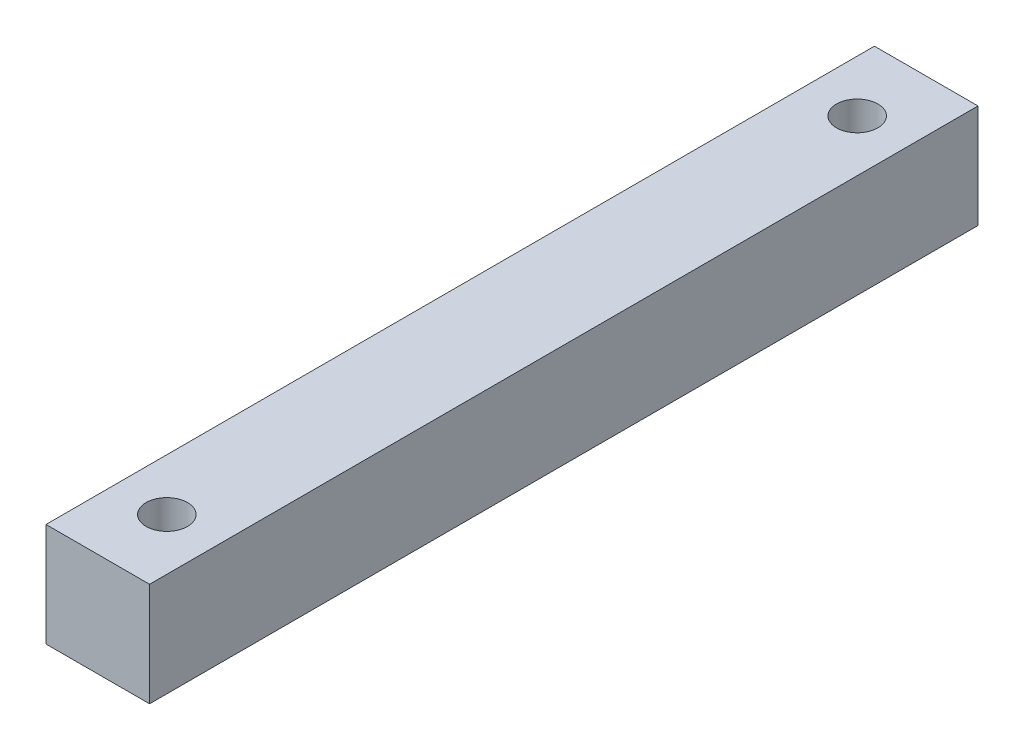
ISO-10303-21;
HEADER;
FILE_DESCRIPTION(('STEP AP214'),'2;1');
FILE_NAME('part.step','',(''),(''),'','','');
FILE_SCHEMA(('AUTOMOTIVE_DESIGN { 1 0 10303 214 1 1 1 1 }'));
ENDSEC;
DATA;
#1=APPLICATION_CONTEXT('core data for automotive mechanical design processes');
#2=APPLICATION_PROTOCOL_DEFINITION('international standard','automotive_design',2000,#1);
#3=PRODUCT_CONTEXT('',#1,'mechanical');
#4=PRODUCT('Part','Part','',(#3));
#5=PRODUCT_RELATED_PRODUCT_CATEGORY('part','',(#4));
#6=PRODUCT_DEFINITION_FORMATION('','',#4);
#7=PRODUCT_DEFINITION_CONTEXT('part definition',#1,'design');
#8=PRODUCT_DEFINITION('design','',#6,#7);
#9=PRODUCT_DEFINITION_SHAPE('','',#8);
#10=(LENGTH_UNIT() NAMED_UNIT(*) SI_UNIT(.MILLI.,.METRE.));
#11=(NAMED_UNIT(*) PLANE_ANGLE_UNIT() SI_UNIT($,.RADIAN.));
#12=(NAMED_UNIT(*) SI_UNIT($,.STERADIAN.) SOLID_ANGLE_UNIT());
#13=UNCERTAINTY_MEASURE_WITH_UNIT(LENGTH_MEASURE(1.E-05),#10,'distance_accuracy_value','');
#14=(GEOMETRIC_REPRESENTATION_CONTEXT(3) GLOBAL_UNCERTAINTY_ASSIGNED_CONTEXT((#13)) GLOBAL_UNIT_ASSIGNED_CONTEXT((#10,
#11,#12)) REPRESENTATION_CONTEXT('',''));
#15=CARTESIAN_POINT('',(0.,0.,0.));
#16=DIRECTION('',(0.,0.,1.));
#17=DIRECTION('',(1.,0.,0.));
#18=AXIS2_PLACEMENT_3D('',#15,#16,#17);
#19=CARTESIAN_POINT('',(0.,0.,120.));
#20=DIRECTION('',(1.,0.,0.));
#21=DIRECTION('',(0.,1.,0.));
#22=AXIS2_PLACEMENT_3D('',#19,#20,#21);
#23=PLANE('',#22);
#24=DIRECTION('',(0.,-1.,0.));
#25=VECTOR('',#24,1.);
#26=CARTESIAN_POINT('',(0.,0.,0.));
#27=LINE('',#26,#25);
#28=CARTESIAN_POINT('',(0.,0.,0.));
#29=VERTEX_POINT('',#28);
#30=CARTESIAN_POINT('',(0.,-15.,0.));
#31=VERTEX_POINT('',#30);
#32=EDGE_CURVE('E104',#29,#31,#27,.T.);
#33=ORIENTED_EDGE('',*,*,#32,.T.);
#34=DIRECTION('',(0.,0.,-1.));
#35=VECTOR('',#34,1.);
#36=CARTESIAN_POINT('',(0.,-15.,120.));
#37=LINE('',#36,#35);
#38=CARTESIAN_POINT('',(0.,-15.,120.));
#39=VERTEX_POINT('',#38);
#40=EDGE_CURVE('E11',#39,#31,#37,.T.);
#41=ORIENTED_EDGE('',*,*,#40,.F.);
#42=DIRECTION('',(0.,-1.,0.));
#43=VECTOR('',#42,1.);
#44=CARTESIAN_POINT('',(0.,0.,120.));
#45=LINE('',#44,#43);
#46=CARTESIAN_POINT('',(0.,0.,120.));
#47=VERTEX_POINT('',#46);
#48=EDGE_CURVE('E92',#47,#39,#45,.T.);
#49=ORIENTED_EDGE('',*,*,#48,.F.);
#50=DIRECTION('',(0.,0.,-1.));
#51=VECTOR('',#50,1.);
#52=CARTESIAN_POINT('',(0.,0.,120.));
#53=LINE('',#52,#51);
#54=EDGE_CURVE('E100',#47,#29,#53,.T.);
#55=ORIENTED_EDGE('',*,*,#54,.T.);
#56=EDGE_LOOP('',(#33,#41,#49,#55));
#57=FACE_BOUND('',#56,.T.);
#58=ADVANCED_FACE('F41',(#57),#23,.F.);
#59=CARTESIAN_POINT('',(0.,-15.,120.));
#60=DIRECTION('',(0.,1.,0.));
#61=DIRECTION('',(0.,0.,1.));
#62=AXIS2_PLACEMENT_3D('',#59,#60,#61);
#63=PLANE('',#62);
#64=CARTESIAN_POINT('',(7.5,-15.,10.));
#65=DIRECTION('',(0.,1.,0.));
#66=DIRECTION('',(0.,0.,1.));
#67=AXIS2_PLACEMENT_3D('',#64,#65,#66);
#68=CIRCLE('',#67,3.);
#69=CARTESIAN_POINT('',(7.5,-15.,13.));
#70=VERTEX_POINT('',#69);
#71=EDGE_CURVE('E107',#70,#70,#68,.T.);
#72=ORIENTED_EDGE('',*,*,#71,.T.);
#73=EDGE_LOOP('',(#72));
#74=FACE_BOUND('',#73,.T.);
#75=CARTESIAN_POINT('',(7.50000000000001,-15.,110.));
#76=DIRECTION('',(0.,1.,0.));
#77=DIRECTION('',(0.,0.,1.));
#78=AXIS2_PLACEMENT_3D('',#75,#76,#77);
#79=CIRCLE('',#78,3.);
#80=CARTESIAN_POINT('',(7.50000000000001,-15.,113.));
#81=VERTEX_POINT('',#80);
#82=EDGE_CURVE('E118',#81,#81,#79,.T.);
#83=ORIENTED_EDGE('',*,*,#82,.T.);
#84=EDGE_LOOP('',(#83));
#85=FACE_BOUND('',#84,.T.);
#86=DIRECTION('',(1.,0.,0.));
#87=VECTOR('',#86,1.);
#88=CARTESIAN_POINT('',(0.,-15.,0.));
#89=LINE('',#88,#87);
#90=CARTESIAN_POINT('',(15.,-15.,0.));
#91=VERTEX_POINT('',#90);
#92=EDGE_CURVE('E96',#31,#91,#89,.T.);
#93=ORIENTED_EDGE('',*,*,#92,.T.);
#94=DIRECTION('',(0.,0.,-1.));
#95=VECTOR('',#94,1.);
#96=CARTESIAN_POINT('',(15.,-15.,120.));
#97=LINE('',#96,#95);
#98=CARTESIAN_POINT('',(15.,-15.,120.));
#99=VERTEX_POINT('',#98);
#100=EDGE_CURVE('E49',#99,#91,#97,.T.);
#101=ORIENTED_EDGE('',*,*,#100,.F.);
#102=DIRECTION('',(1.,0.,0.));
#103=VECTOR('',#102,1.);
#104=CARTESIAN_POINT('',(0.,-15.,120.));
#105=LINE('',#104,#103);
#106=EDGE_CURVE('E87',#39,#99,#105,.T.);
#107=ORIENTED_EDGE('',*,*,#106,.F.);
#108=ORIENTED_EDGE('',*,*,#40,.T.);
#109=EDGE_LOOP('',(#93,#101,#107,#108));
#110=FACE_BOUND('',#109,.T.);
#111=ADVANCED_FACE('F95',(#74,#85,#110),#63,.F.);
#112=CARTESIAN_POINT('',(15.,0.,120.));
#113=DIRECTION('',(-1.,0.,0.));
#114=DIRECTION('',(0.,-1.,0.));
#115=AXIS2_PLACEMENT_3D('',#112,#113,#114);
#116=PLANE('',#115);
#117=DIRECTION('',(0.,1.,0.));
#118=VECTOR('',#117,1.);
#119=CARTESIAN_POINT('',(15.,0.,0.));
#120=LINE('',#119,#118);
#121=CARTESIAN_POINT('',(15.,0.,0.));
#122=VERTEX_POINT('',#121);
#123=EDGE_CURVE('E74',#91,#122,#120,.T.);
#124=ORIENTED_EDGE('',*,*,#123,.T.);
#125=DIRECTION('',(0.,0.,-1.));
#126=VECTOR('',#125,1.);
#127=CARTESIAN_POINT('',(15.,0.,120.));
#128=LINE('',#127,#126);
#129=CARTESIAN_POINT('',(15.,0.,120.));
#130=VERTEX_POINT('',#129);
#131=EDGE_CURVE('E97',#130,#122,#128,.T.);
#132=ORIENTED_EDGE('',*,*,#131,.F.);
#133=DIRECTION('',(0.,1.,0.));
#134=VECTOR('',#133,1.);
#135=CARTESIAN_POINT('',(15.,0.,120.));
#136=LINE('',#135,#134);
#137=EDGE_CURVE('E90',#99,#130,#136,.T.);
#138=ORIENTED_EDGE('',*,*,#137,.F.);
#139=ORIENTED_EDGE('',*,*,#100,.T.);
#140=EDGE_LOOP('',(#124,#132,#138,#139));
#141=FACE_BOUND('',#140,.T.);
#142=ADVANCED_FACE('F98',(#141),#116,.F.);
#143=CARTESIAN_POINT('',(0.,0.,120.));
#144=DIRECTION('',(0.,-1.,0.));
#145=DIRECTION('',(0.,0.,-1.));
#146=AXIS2_PLACEMENT_3D('',#143,#144,#145);
#147=PLANE('',#146);
#148=CARTESIAN_POINT('',(7.5,0.,10.));
#149=DIRECTION('',(0.,1.,0.));
#150=DIRECTION('',(0.,0.,1.));
#151=AXIS2_PLACEMENT_3D('',#148,#149,#150);
#152=CIRCLE('',#151,3.);
#153=CARTESIAN_POINT('',(7.5,0.,13.));
#154=VERTEX_POINT('',#153);
#155=EDGE_CURVE('E124',#154,#154,#152,.T.);
#156=ORIENTED_EDGE('',*,*,#155,.F.);
#157=EDGE_LOOP('',(#156));
#158=FACE_BOUND('',#157,.T.);
#159=CARTESIAN_POINT('',(7.50000000000001,0.,110.));
#160=DIRECTION('',(0.,1.,0.));
#161=DIRECTION('',(0.,0.,1.));
#162=AXIS2_PLACEMENT_3D('',#159,#160,#161);
#163=CIRCLE('',#162,3.);
#164=CARTESIAN_POINT('',(7.50000000000001,0.,113.));
#165=VERTEX_POINT('',#164);
#166=EDGE_CURVE('E121',#165,#165,#163,.T.);
#167=ORIENTED_EDGE('',*,*,#166,.F.);
#168=EDGE_LOOP('',(#167));
#169=FACE_BOUND('',#168,.T.);
#170=DIRECTION('',(-1.,0.,0.));
#171=VECTOR('',#170,1.);
#172=CARTESIAN_POINT('',(0.,0.,0.));
#173=LINE('',#172,#171);
#174=EDGE_CURVE('E80',#122,#29,#173,.T.);
#175=ORIENTED_EDGE('',*,*,#174,.T.);
#176=ORIENTED_EDGE('',*,*,#54,.F.);
#177=DIRECTION('',(-1.,0.,0.));
#178=VECTOR('',#177,1.);
#179=CARTESIAN_POINT('',(0.,0.,120.));
#180=LINE('',#179,#178);
#181=EDGE_CURVE('E57',#130,#47,#180,.T.);
#182=ORIENTED_EDGE('',*,*,#181,.F.);
#183=ORIENTED_EDGE('',*,*,#131,.T.);
#184=EDGE_LOOP('',(#175,#176,#182,#183));
#185=FACE_BOUND('',#184,.T.);
#186=ADVANCED_FACE('F112',(#158,#169,#185),#147,.F.);
#187=CARTESIAN_POINT('',(0.,0.,120.));
#188=DIRECTION('',(0.,0.,1.));
#189=DIRECTION('',(1.,0.,0.));
#190=AXIS2_PLACEMENT_3D('',#187,#188,#189);
#191=PLANE('',#190);
#192=ORIENTED_EDGE('',*,*,#48,.T.);
#193=ORIENTED_EDGE('',*,*,#106,.T.);
#194=ORIENTED_EDGE('',*,*,#137,.T.);
#195=ORIENTED_EDGE('',*,*,#181,.T.);
#196=EDGE_LOOP('',(#192,#193,#194,#195));
#197=FACE_BOUND('',#196,.T.);
#198=ADVANCED_FACE('F88',(#197),#191,.T.);
#199=CARTESIAN_POINT('',(0.,0.,0.));
#200=DIRECTION('',(0.,0.,1.));
#201=DIRECTION('',(1.,0.,0.));
#202=AXIS2_PLACEMENT_3D('',#199,#200,#201);
#203=PLANE('',#202);
#204=ORIENTED_EDGE('',*,*,#32,.F.);
#205=ORIENTED_EDGE('',*,*,#174,.F.);
#206=ORIENTED_EDGE('',*,*,#123,.F.);
#207=ORIENTED_EDGE('',*,*,#92,.F.);
#208=EDGE_LOOP('',(#204,#205,#206,#207));
#209=FACE_BOUND('',#208,.T.);
#210=ADVANCED_FACE('F115',(#209),#203,.F.);
#211=CARTESIAN_POINT('',(7.50000000000001,-15.,110.));
#212=DIRECTION('',(0.,1.,0.));
#213=DIRECTION('',(0.,0.,1.));
#214=AXIS2_PLACEMENT_3D('',#211,#212,#213);
#215=CYLINDRICAL_SURFACE('',#214,3.);
#216=ORIENTED_EDGE('',*,*,#82,.F.);
#217=EDGE_LOOP('',(#216));
#218=FACE_BOUND('',#217,.T.);
#219=ORIENTED_EDGE('',*,*,#166,.T.);
#220=EDGE_LOOP('',(#219));
#221=FACE_BOUND('',#220,.T.);
#222=ADVANCED_FACE('F135',(#218,#221),#215,.F.);
#223=CARTESIAN_POINT('',(7.5,-15.,10.));
#224=DIRECTION('',(0.,1.,0.));
#225=DIRECTION('',(0.,0.,1.));
#226=AXIS2_PLACEMENT_3D('',#223,#224,#225);
#227=CYLINDRICAL_SURFACE('',#226,3.);
#228=ORIENTED_EDGE('',*,*,#71,.F.);
#229=EDGE_LOOP('',(#228));
#230=FACE_BOUND('',#229,.T.);
#231=ORIENTED_EDGE('',*,*,#155,.T.);
#232=EDGE_LOOP('',(#231));
#233=FACE_BOUND('',#232,.T.);
#234=ADVANCED_FACE('F132',(#230,#233),#227,.F.);
#235=CLOSED_SHELL('',(#58,#111,#142,#186,#198,#210,#222,#234));
#236=MANIFOLD_SOLID_BREP('B2',#235);
#237=ADVANCED_BREP_SHAPE_REPRESENTATION('',(#18,#236),#14);
#238=SHAPE_DEFINITION_REPRESENTATION(#9,#237);
ENDSEC;
END-ISO-10303-21;
